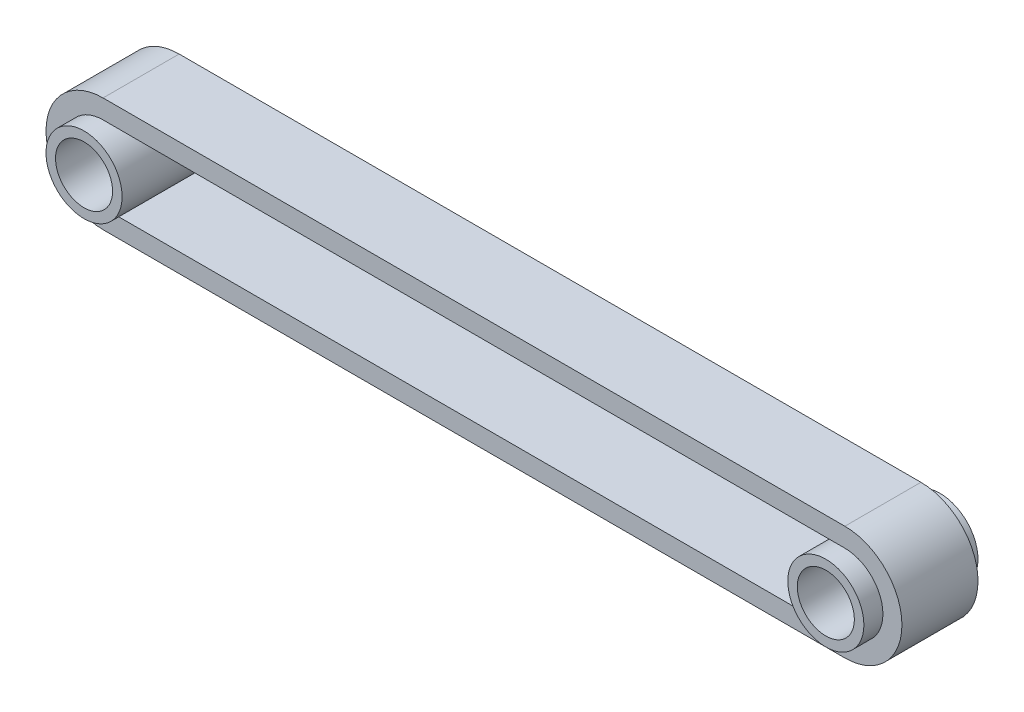
ISO-10303-21;
HEADER;
FILE_DESCRIPTION(('STEP AP214'),'2;1');
FILE_NAME('part.step','',(''),(''),'','','');
FILE_SCHEMA(('AUTOMOTIVE_DESIGN { 1 0 10303 214 1 1 1 1 }'));
ENDSEC;
DATA;
#1=APPLICATION_CONTEXT('core data for automotive mechanical design processes');
#2=APPLICATION_PROTOCOL_DEFINITION('international standard','automotive_design',2000,#1);
#3=PRODUCT_CONTEXT('',#1,'mechanical');
#4=PRODUCT('Part','Part','',(#3));
#5=PRODUCT_RELATED_PRODUCT_CATEGORY('part','',(#4));
#6=PRODUCT_DEFINITION_FORMATION('','',#4);
#7=PRODUCT_DEFINITION_CONTEXT('part definition',#1,'design');
#8=PRODUCT_DEFINITION('design','',#6,#7);
#9=PRODUCT_DEFINITION_SHAPE('','',#8);
#10=(LENGTH_UNIT() NAMED_UNIT(*) SI_UNIT(.MILLI.,.METRE.));
#11=(NAMED_UNIT(*) PLANE_ANGLE_UNIT() SI_UNIT($,.RADIAN.));
#12=(NAMED_UNIT(*) SI_UNIT($,.STERADIAN.) SOLID_ANGLE_UNIT());
#13=UNCERTAINTY_MEASURE_WITH_UNIT(LENGTH_MEASURE(1.E-05),#10,'distance_accuracy_value','');
#14=(GEOMETRIC_REPRESENTATION_CONTEXT(3) GLOBAL_UNCERTAINTY_ASSIGNED_CONTEXT((#13)) GLOBAL_UNIT_ASSIGNED_CONTEXT((#10,
#11,#12)) REPRESENTATION_CONTEXT('',''));
#15=CARTESIAN_POINT('',(0.,0.,0.));
#16=DIRECTION('',(0.,0.,1.));
#17=DIRECTION('',(1.,0.,0.));
#18=AXIS2_PLACEMENT_3D('',#15,#16,#17);
#19=CARTESIAN_POINT('',(0.,0.,60.));
#20=DIRECTION('',(0.,0.,-1.));
#21=DIRECTION('',(-1.,0.,0.));
#22=AXIS2_PLACEMENT_3D('',#19,#20,#21);
#23=CYLINDRICAL_SURFACE('',#22,20.);
#24=CARTESIAN_POINT('',(0.,0.,0.));
#25=DIRECTION('',(0.,0.,1.));
#26=DIRECTION('',(1.,0.,0.));
#27=AXIS2_PLACEMENT_3D('',#24,#25,#26);
#28=CIRCLE('',#27,20.);
#29=CARTESIAN_POINT('',(20.,0.,0.));
#30=VERTEX_POINT('',#29);
#31=EDGE_CURVE('E40',#30,#30,#28,.T.);
#32=ORIENTED_EDGE('',*,*,#31,.T.);
#33=EDGE_LOOP('',(#32));
#34=FACE_BOUND('',#33,.T.);
#35=CARTESIAN_POINT('',(0.,0.,60.));
#36=DIRECTION('',(0.,0.,1.));
#37=DIRECTION('',(1.,0.,0.));
#38=AXIS2_PLACEMENT_3D('',#35,#36,#37);
#39=CIRCLE('',#38,20.);
#40=CARTESIAN_POINT('',(20.,0.,60.));
#41=VERTEX_POINT('',#40);
#42=EDGE_CURVE('E11',#41,#41,#39,.T.);
#43=ORIENTED_EDGE('',*,*,#42,.F.);
#44=EDGE_LOOP('',(#43));
#45=FACE_BOUND('',#44,.T.);
#46=DIRECTION('',(0.,0.,1.));
#47=VECTOR('',#46,1.);
#48=CARTESIAN_POINT('',(0.,20.,9.99999999999999));
#49=LINE('',#48,#47);
#50=CARTESIAN_POINT('',(0.,20.,9.99999999999999));
#51=VERTEX_POINT('',#50);
#52=CARTESIAN_POINT('',(0.,20.,50.));
#53=VERTEX_POINT('',#52);
#54=EDGE_CURVE('E126',#51,#53,#49,.T.);
#55=ORIENTED_EDGE('',*,*,#54,.T.);
#56=CARTESIAN_POINT('',(0.,0.,50.));
#57=DIRECTION('',(0.,0.,1.));
#58=DIRECTION('',(1.,0.,0.));
#59=AXIS2_PLACEMENT_3D('',#56,#57,#58);
#60=CIRCLE('',#59,20.);
#61=CARTESIAN_POINT('',(0.,-20.,50.));
#62=VERTEX_POINT('',#61);
#63=EDGE_CURVE('E117',#53,#62,#60,.T.);
#64=ORIENTED_EDGE('',*,*,#63,.T.);
#65=DIRECTION('',(0.,0.,1.));
#66=VECTOR('',#65,1.);
#67=CARTESIAN_POINT('',(0.,-20.,9.99999999999999));
#68=LINE('',#67,#66);
#69=CARTESIAN_POINT('',(0.,-20.,9.99999999999999));
#70=VERTEX_POINT('',#69);
#71=EDGE_CURVE('E116',#70,#62,#68,.T.);
#72=ORIENTED_EDGE('',*,*,#71,.F.);
#73=CARTESIAN_POINT('',(0.,0.,9.99999999999999));
#74=DIRECTION('',(0.,0.,1.));
#75=DIRECTION('',(1.,0.,0.));
#76=AXIS2_PLACEMENT_3D('',#73,#74,#75);
#77=CIRCLE('',#76,20.);
#78=EDGE_CURVE('E51',#51,#70,#77,.T.);
#79=ORIENTED_EDGE('',*,*,#78,.F.);
#80=EDGE_LOOP('',(#55,#64,#72,#79));
#81=FACE_BOUND('',#80,.T.);
#82=ADVANCED_FACE('F37',(#34,#45,#81),#23,.T.);
#83=CARTESIAN_POINT('',(0.,0.,60.));
#84=DIRECTION('',(0.,0.,1.));
#85=DIRECTION('',(1.,0.,0.));
#86=AXIS2_PLACEMENT_3D('',#83,#84,#85);
#87=PLANE('',#86);
#88=ORIENTED_EDGE('',*,*,#42,.T.);
#89=EDGE_LOOP('',(#88));
#90=FACE_BOUND('',#89,.T.);
#91=CARTESIAN_POINT('',(0.,0.,60.));
#92=DIRECTION('',(0.,0.,1.));
#93=DIRECTION('',(1.,0.,0.));
#94=AXIS2_PLACEMENT_3D('',#91,#92,#93);
#95=CIRCLE('',#94,15.);
#96=CARTESIAN_POINT('',(15.,0.,60.));
#97=VERTEX_POINT('',#96);
#98=EDGE_CURVE('E165',#97,#97,#95,.T.);
#99=ORIENTED_EDGE('',*,*,#98,.F.);
#100=EDGE_LOOP('',(#99));
#101=FACE_BOUND('',#100,.T.);
#102=ADVANCED_FACE('F185',(#90,#101),#87,.T.);
#103=CARTESIAN_POINT('',(0.,0.,0.));
#104=DIRECTION('',(0.,0.,1.));
#105=DIRECTION('',(1.,0.,0.));
#106=AXIS2_PLACEMENT_3D('',#103,#104,#105);
#107=PLANE('',#106);
#108=ORIENTED_EDGE('',*,*,#31,.F.);
#109=EDGE_LOOP('',(#108));
#110=FACE_BOUND('',#109,.T.);
#111=CARTESIAN_POINT('',(0.,0.,0.));
#112=DIRECTION('',(0.,0.,1.));
#113=DIRECTION('',(1.,0.,0.));
#114=AXIS2_PLACEMENT_3D('',#111,#112,#113);
#115=CIRCLE('',#114,15.);
#116=CARTESIAN_POINT('',(15.,0.,0.));
#117=VERTEX_POINT('',#116);
#118=EDGE_CURVE('E159',#117,#117,#115,.T.);
#119=ORIENTED_EDGE('',*,*,#118,.T.);
#120=EDGE_LOOP('',(#119));
#121=FACE_BOUND('',#120,.T.);
#122=ADVANCED_FACE('F171',(#110,#121),#107,.F.);
#123=CARTESIAN_POINT('',(0.,0.,60.));
#124=DIRECTION('',(0.,0.,-1.));
#125=DIRECTION('',(-1.,0.,0.));
#126=AXIS2_PLACEMENT_3D('',#123,#124,#125);
#127=CYLINDRICAL_SURFACE('',#126,15.);
#128=ORIENTED_EDGE('',*,*,#98,.T.);
#129=EDGE_LOOP('',(#128));
#130=FACE_BOUND('',#129,.T.);
#131=ORIENTED_EDGE('',*,*,#118,.F.);
#132=EDGE_LOOP('',(#131));
#133=FACE_BOUND('',#132,.T.);
#134=ADVANCED_FACE('F173',(#130,#133),#127,.F.);
#135=CARTESIAN_POINT('',(0.,0.,9.99999999999999));
#136=DIRECTION('',(0.,0.,1.));
#137=DIRECTION('',(1.,0.,0.));
#138=AXIS2_PLACEMENT_3D('',#135,#136,#137);
#139=CYLINDRICAL_SURFACE('',#138,30.);
#140=CARTESIAN_POINT('',(0.,0.,50.));
#141=DIRECTION('',(0.,0.,1.));
#142=DIRECTION('',(1.,0.,0.));
#143=AXIS2_PLACEMENT_3D('',#140,#141,#142);
#144=CIRCLE('',#143,30.);
#145=CARTESIAN_POINT('',(0.,30.,50.));
#146=VERTEX_POINT('',#145);
#147=CARTESIAN_POINT('',(0.,-30.,50.));
#148=VERTEX_POINT('',#147);
#149=EDGE_CURVE('E146',#146,#148,#144,.T.);
#150=ORIENTED_EDGE('',*,*,#149,.F.);
#151=DIRECTION('',(0.,0.,1.));
#152=VECTOR('',#151,1.);
#153=CARTESIAN_POINT('',(0.,30.,9.99999999999999));
#154=LINE('',#153,#152);
#155=CARTESIAN_POINT('',(0.,30.,9.99999999999999));
#156=VERTEX_POINT('',#155);
#157=EDGE_CURVE('E157',#156,#146,#154,.T.);
#158=ORIENTED_EDGE('',*,*,#157,.F.);
#159=CARTESIAN_POINT('',(0.,0.,9.99999999999999));
#160=DIRECTION('',(0.,0.,1.));
#161=DIRECTION('',(1.,0.,0.));
#162=AXIS2_PLACEMENT_3D('',#159,#160,#161);
#163=CIRCLE('',#162,30.);
#164=CARTESIAN_POINT('',(0.,-30.,9.99999999999999));
#165=VERTEX_POINT('',#164);
#166=EDGE_CURVE('E132',#156,#165,#163,.T.);
#167=ORIENTED_EDGE('',*,*,#166,.T.);
#168=DIRECTION('',(0.,0.,1.));
#169=VECTOR('',#168,1.);
#170=CARTESIAN_POINT('',(0.,-30.,9.99999999999999));
#171=LINE('',#170,#169);
#172=EDGE_CURVE('E145',#165,#148,#171,.T.);
#173=ORIENTED_EDGE('',*,*,#172,.T.);
#174=EDGE_LOOP('',(#150,#158,#167,#173));
#175=FACE_BOUND('',#174,.T.);
#176=ADVANCED_FACE('F175',(#175),#139,.T.);
#177=CARTESIAN_POINT('',(390.,30.,9.99999999999999));
#178=DIRECTION('',(0.,1.,0.));
#179=DIRECTION('',(-1.,0.,0.));
#180=AXIS2_PLACEMENT_3D('',#177,#178,#179);
#181=PLANE('',#180);
#182=DIRECTION('',(-1.,0.,0.));
#183=VECTOR('',#182,1.);
#184=CARTESIAN_POINT('',(390.,30.,50.));
#185=LINE('',#184,#183);
#186=CARTESIAN_POINT('',(390.,30.,50.));
#187=VERTEX_POINT('',#186);
#188=EDGE_CURVE('E136',#187,#146,#185,.T.);
#189=ORIENTED_EDGE('',*,*,#188,.F.);
#190=DIRECTION('',(0.,0.,1.));
#191=VECTOR('',#190,1.);
#192=CARTESIAN_POINT('',(390.,30.,9.99999999999999));
#193=LINE('',#192,#191);
#194=CARTESIAN_POINT('',(390.,30.,9.99999999999999));
#195=VERTEX_POINT('',#194);
#196=EDGE_CURVE('E160',#195,#187,#193,.T.);
#197=ORIENTED_EDGE('',*,*,#196,.F.);
#198=DIRECTION('',(-1.,0.,0.));
#199=VECTOR('',#198,1.);
#200=CARTESIAN_POINT('',(390.,30.,9.99999999999999));
#201=LINE('',#200,#199);
#202=EDGE_CURVE('E142',#195,#156,#201,.T.);
#203=ORIENTED_EDGE('',*,*,#202,.T.);
#204=ORIENTED_EDGE('',*,*,#157,.T.);
#205=EDGE_LOOP('',(#189,#197,#203,#204));
#206=FACE_BOUND('',#205,.T.);
#207=ADVANCED_FACE('F182',(#206),#181,.T.);
#208=CARTESIAN_POINT('',(390.,0.,9.99999999999999));
#209=DIRECTION('',(0.,0.,1.));
#210=DIRECTION('',(1.,0.,0.));
#211=AXIS2_PLACEMENT_3D('',#208,#209,#210);
#212=CYLINDRICAL_SURFACE('',#211,30.);
#213=CARTESIAN_POINT('',(390.,0.,50.));
#214=DIRECTION('',(0.,0.,1.));
#215=DIRECTION('',(1.,0.,0.));
#216=AXIS2_PLACEMENT_3D('',#213,#214,#215);
#217=CIRCLE('',#216,30.);
#218=CARTESIAN_POINT('',(390.,-30.,50.));
#219=VERTEX_POINT('',#218);
#220=EDGE_CURVE('E152',#219,#187,#217,.T.);
#221=ORIENTED_EDGE('',*,*,#220,.F.);
#222=DIRECTION('',(0.,0.,1.));
#223=VECTOR('',#222,1.);
#224=CARTESIAN_POINT('',(390.,-30.,9.99999999999999));
#225=LINE('',#224,#223);
#226=CARTESIAN_POINT('',(390.,-30.,9.99999999999999));
#227=VERTEX_POINT('',#226);
#228=EDGE_CURVE('E162',#227,#219,#225,.T.);
#229=ORIENTED_EDGE('',*,*,#228,.F.);
#230=CARTESIAN_POINT('',(390.,0.,9.99999999999999));
#231=DIRECTION('',(0.,0.,1.));
#232=DIRECTION('',(1.,0.,0.));
#233=AXIS2_PLACEMENT_3D('',#230,#231,#232);
#234=CIRCLE('',#233,30.);
#235=EDGE_CURVE('E139',#227,#195,#234,.T.);
#236=ORIENTED_EDGE('',*,*,#235,.T.);
#237=ORIENTED_EDGE('',*,*,#196,.T.);
#238=EDGE_LOOP('',(#221,#229,#236,#237));
#239=FACE_BOUND('',#238,.T.);
#240=ADVANCED_FACE('F252',(#239),#212,.T.);
#241=CARTESIAN_POINT('',(0.,-30.,9.99999999999999));
#242=DIRECTION('',(0.,-1.,0.));
#243=DIRECTION('',(1.,0.,0.));
#244=AXIS2_PLACEMENT_3D('',#241,#242,#243);
#245=PLANE('',#244);
#246=DIRECTION('',(1.,0.,0.));
#247=VECTOR('',#246,1.);
#248=CARTESIAN_POINT('',(0.,-30.,50.));
#249=LINE('',#248,#247);
#250=EDGE_CURVE('E149',#148,#219,#249,.T.);
#251=ORIENTED_EDGE('',*,*,#250,.F.);
#252=ORIENTED_EDGE('',*,*,#172,.F.);
#253=DIRECTION('',(1.,0.,0.));
#254=VECTOR('',#253,1.);
#255=CARTESIAN_POINT('',(0.,-30.,9.99999999999999));
#256=LINE('',#255,#254);
#257=EDGE_CURVE('E135',#165,#227,#256,.T.);
#258=ORIENTED_EDGE('',*,*,#257,.T.);
#259=ORIENTED_EDGE('',*,*,#228,.T.);
#260=EDGE_LOOP('',(#251,#252,#258,#259));
#261=FACE_BOUND('',#260,.T.);
#262=ADVANCED_FACE('F247',(#261),#245,.T.);
#263=CARTESIAN_POINT('',(0.,0.,9.99999999999999));
#264=DIRECTION('',(0.,0.,1.));
#265=DIRECTION('',(1.,0.,0.));
#266=AXIS2_PLACEMENT_3D('',#263,#264,#265);
#267=PLANE('',#266);
#268=DIRECTION('',(-1.,0.,0.));
#269=VECTOR('',#268,1.);
#270=CARTESIAN_POINT('',(0.,20.,9.99999999999999));
#271=LINE('',#270,#269);
#272=CARTESIAN_POINT('',(390.,20.,9.99999999999999));
#273=VERTEX_POINT('',#272);
#274=EDGE_CURVE('E128',#273,#51,#271,.T.);
#275=ORIENTED_EDGE('',*,*,#274,.T.);
#276=ORIENTED_EDGE('',*,*,#78,.T.);
#277=DIRECTION('',(1.,0.,0.));
#278=VECTOR('',#277,1.);
#279=CARTESIAN_POINT('',(0.,-20.,9.99999999999999));
#280=LINE('',#279,#278);
#281=CARTESIAN_POINT('',(390.,-20.,9.99999999999999));
#282=VERTEX_POINT('',#281);
#283=EDGE_CURVE('E207',#70,#282,#280,.T.);
#284=ORIENTED_EDGE('',*,*,#283,.T.);
#285=CARTESIAN_POINT('',(390.,0.,9.99999999999999));
#286=DIRECTION('',(0.,0.,1.));
#287=DIRECTION('',(1.,0.,0.));
#288=AXIS2_PLACEMENT_3D('',#285,#286,#287);
#289=CIRCLE('',#288,20.);
#290=EDGE_CURVE('E123',#282,#273,#289,.T.);
#291=ORIENTED_EDGE('',*,*,#290,.T.);
#292=EDGE_LOOP('',(#275,#276,#284,#291));
#293=FACE_BOUND('',#292,.T.);
#294=ORIENTED_EDGE('',*,*,#166,.F.);
#295=ORIENTED_EDGE('',*,*,#202,.F.);
#296=ORIENTED_EDGE('',*,*,#235,.F.);
#297=ORIENTED_EDGE('',*,*,#257,.F.);
#298=EDGE_LOOP('',(#294,#295,#296,#297));
#299=FACE_BOUND('',#298,.T.);
#300=ADVANCED_FACE('F244',(#293,#299),#267,.F.);
#301=CARTESIAN_POINT('',(0.,0.,50.));
#302=DIRECTION('',(0.,0.,1.));
#303=DIRECTION('',(1.,0.,0.));
#304=AXIS2_PLACEMENT_3D('',#301,#302,#303);
#305=PLANE('',#304);
#306=ORIENTED_EDGE('',*,*,#63,.F.);
#307=DIRECTION('',(-1.,0.,0.));
#308=VECTOR('',#307,1.);
#309=CARTESIAN_POINT('',(0.,20.,50.));
#310=LINE('',#309,#308);
#311=CARTESIAN_POINT('',(390.,20.,50.));
#312=VERTEX_POINT('',#311);
#313=EDGE_CURVE('E110',#312,#53,#310,.T.);
#314=ORIENTED_EDGE('',*,*,#313,.F.);
#315=CARTESIAN_POINT('',(390.,0.,50.));
#316=DIRECTION('',(0.,0.,1.));
#317=DIRECTION('',(1.,0.,0.));
#318=AXIS2_PLACEMENT_3D('',#315,#316,#317);
#319=CIRCLE('',#318,20.);
#320=CARTESIAN_POINT('',(390.,-20.,50.));
#321=VERTEX_POINT('',#320);
#322=EDGE_CURVE('E104',#321,#312,#319,.T.);
#323=ORIENTED_EDGE('',*,*,#322,.F.);
#324=DIRECTION('',(1.,0.,0.));
#325=VECTOR('',#324,1.);
#326=CARTESIAN_POINT('',(0.,-20.,50.));
#327=LINE('',#326,#325);
#328=EDGE_CURVE('E108',#62,#321,#327,.T.);
#329=ORIENTED_EDGE('',*,*,#328,.F.);
#330=EDGE_LOOP('',(#306,#314,#323,#329));
#331=FACE_BOUND('',#330,.T.);
#332=ORIENTED_EDGE('',*,*,#149,.T.);
#333=ORIENTED_EDGE('',*,*,#250,.T.);
#334=ORIENTED_EDGE('',*,*,#220,.T.);
#335=ORIENTED_EDGE('',*,*,#188,.T.);
#336=EDGE_LOOP('',(#332,#333,#334,#335));
#337=FACE_BOUND('',#336,.T.);
#338=ADVANCED_FACE('F106',(#331,#337),#305,.T.);
#339=CARTESIAN_POINT('',(0.,20.,9.99999999999999));
#340=DIRECTION('',(0.,1.,0.));
#341=DIRECTION('',(-1.,0.,0.));
#342=AXIS2_PLACEMENT_3D('',#339,#340,#341);
#343=PLANE('',#342);
#344=ORIENTED_EDGE('',*,*,#313,.T.);
#345=ORIENTED_EDGE('',*,*,#54,.F.);
#346=ORIENTED_EDGE('',*,*,#274,.F.);
#347=DIRECTION('',(0.,0.,1.));
#348=VECTOR('',#347,1.);
#349=CARTESIAN_POINT('',(390.,20.,9.99999999999999));
#350=LINE('',#349,#348);
#351=EDGE_CURVE('E124',#273,#312,#350,.T.);
#352=ORIENTED_EDGE('',*,*,#351,.T.);
#353=EDGE_LOOP('',(#344,#345,#346,#352));
#354=FACE_BOUND('',#353,.T.);
#355=ADVANCED_FACE('F236',(#354),#343,.F.);
#356=CARTESIAN_POINT('',(0.,-20.,9.99999999999999));
#357=DIRECTION('',(0.,-1.,0.));
#358=DIRECTION('',(1.,0.,0.));
#359=AXIS2_PLACEMENT_3D('',#356,#357,#358);
#360=PLANE('',#359);
#361=ORIENTED_EDGE('',*,*,#328,.T.);
#362=DIRECTION('',(0.,0.,1.));
#363=VECTOR('',#362,1.);
#364=CARTESIAN_POINT('',(390.,-20.,9.99999999999999));
#365=LINE('',#364,#363);
#366=EDGE_CURVE('E58',#282,#321,#365,.T.);
#367=ORIENTED_EDGE('',*,*,#366,.F.);
#368=ORIENTED_EDGE('',*,*,#283,.F.);
#369=ORIENTED_EDGE('',*,*,#71,.T.);
#370=EDGE_LOOP('',(#361,#367,#368,#369));
#371=FACE_BOUND('',#370,.T.);
#372=ADVANCED_FACE('F114',(#371),#360,.F.);
#373=CARTESIAN_POINT('',(390.,0.,60.));
#374=DIRECTION('',(0.,0.,1.));
#375=DIRECTION('',(1.,0.,0.));
#376=AXIS2_PLACEMENT_3D('',#373,#374,#375);
#377=PLANE('',#376);
#378=CARTESIAN_POINT('',(390.,0.,60.));
#379=DIRECTION('',(0.,0.,1.));
#380=DIRECTION('',(1.,0.,0.));
#381=AXIS2_PLACEMENT_3D('',#378,#379,#380);
#382=CIRCLE('',#381,20.);
#383=CARTESIAN_POINT('',(410.,0.,60.));
#384=VERTEX_POINT('',#383);
#385=EDGE_CURVE('E204',#384,#384,#382,.T.);
#386=ORIENTED_EDGE('',*,*,#385,.T.);
#387=EDGE_LOOP('',(#386));
#388=FACE_BOUND('',#387,.T.);
#389=CARTESIAN_POINT('',(390.,0.,60.));
#390=DIRECTION('',(0.,0.,1.));
#391=DIRECTION('',(1.,0.,0.));
#392=AXIS2_PLACEMENT_3D('',#389,#390,#391);
#393=CIRCLE('',#392,15.);
#394=CARTESIAN_POINT('',(405.,0.,60.));
#395=VERTEX_POINT('',#394);
#396=EDGE_CURVE('E213',#395,#395,#393,.T.);
#397=ORIENTED_EDGE('',*,*,#396,.F.);
#398=EDGE_LOOP('',(#397));
#399=FACE_BOUND('',#398,.T.);
#400=ADVANCED_FACE('F225',(#388,#399),#377,.T.);
#401=CARTESIAN_POINT('',(390.,0.,0.));
#402=DIRECTION('',(0.,0.,1.));
#403=DIRECTION('',(1.,0.,0.));
#404=AXIS2_PLACEMENT_3D('',#401,#402,#403);
#405=PLANE('',#404);
#406=CARTESIAN_POINT('',(390.,0.,0.));
#407=DIRECTION('',(0.,0.,1.));
#408=DIRECTION('',(1.,0.,0.));
#409=AXIS2_PLACEMENT_3D('',#406,#407,#408);
#410=CIRCLE('',#409,20.);
#411=CARTESIAN_POINT('',(410.,0.,0.));
#412=VERTEX_POINT('',#411);
#413=EDGE_CURVE('E210',#412,#412,#410,.T.);
#414=ORIENTED_EDGE('',*,*,#413,.F.);
#415=EDGE_LOOP('',(#414));
#416=FACE_BOUND('',#415,.T.);
#417=CARTESIAN_POINT('',(390.,0.,0.));
#418=DIRECTION('',(0.,0.,1.));
#419=DIRECTION('',(1.,0.,0.));
#420=AXIS2_PLACEMENT_3D('',#417,#418,#419);
#421=CIRCLE('',#420,15.);
#422=CARTESIAN_POINT('',(405.,0.,0.));
#423=VERTEX_POINT('',#422);
#424=EDGE_CURVE('E216',#423,#423,#421,.T.);
#425=ORIENTED_EDGE('',*,*,#424,.T.);
#426=EDGE_LOOP('',(#425));
#427=FACE_BOUND('',#426,.T.);
#428=ADVANCED_FACE('F227',(#416,#427),#405,.F.);
#429=CARTESIAN_POINT('',(390.,0.,60.));
#430=DIRECTION('',(0.,0.,-1.));
#431=DIRECTION('',(-1.,0.,0.));
#432=AXIS2_PLACEMENT_3D('',#429,#430,#431);
#433=CYLINDRICAL_SURFACE('',#432,20.);
#434=ORIENTED_EDGE('',*,*,#351,.F.);
#435=ORIENTED_EDGE('',*,*,#290,.F.);
#436=ORIENTED_EDGE('',*,*,#366,.T.);
#437=ORIENTED_EDGE('',*,*,#322,.T.);
#438=EDGE_LOOP('',(#434,#435,#436,#437));
#439=FACE_BOUND('',#438,.T.);
#440=ORIENTED_EDGE('',*,*,#385,.F.);
#441=EDGE_LOOP('',(#440));
#442=FACE_BOUND('',#441,.T.);
#443=ORIENTED_EDGE('',*,*,#413,.T.);
#444=EDGE_LOOP('',(#443));
#445=FACE_BOUND('',#444,.T.);
#446=ADVANCED_FACE('F120',(#439,#442,#445),#433,.T.);
#447=CARTESIAN_POINT('',(390.,0.,60.));
#448=DIRECTION('',(0.,0.,-1.));
#449=DIRECTION('',(-1.,0.,0.));
#450=AXIS2_PLACEMENT_3D('',#447,#448,#449);
#451=CYLINDRICAL_SURFACE('',#450,15.);
#452=ORIENTED_EDGE('',*,*,#396,.T.);
#453=EDGE_LOOP('',(#452));
#454=FACE_BOUND('',#453,.T.);
#455=ORIENTED_EDGE('',*,*,#424,.F.);
#456=EDGE_LOOP('',(#455));
#457=FACE_BOUND('',#456,.T.);
#458=ADVANCED_FACE('F222',(#454,#457),#451,.F.);
#459=CLOSED_SHELL('',(#82,#102,#122,#134,#176,#207,#240,#262,#300,#338,#355,#372,#400,#428,#446,#458));
#460=MANIFOLD_SOLID_BREP('B2',#459);
#461=ADVANCED_BREP_SHAPE_REPRESENTATION('',(#18,#460),#14);
#462=SHAPE_DEFINITION_REPRESENTATION(#9,#461);
ENDSEC;
END-ISO-10303-21;
